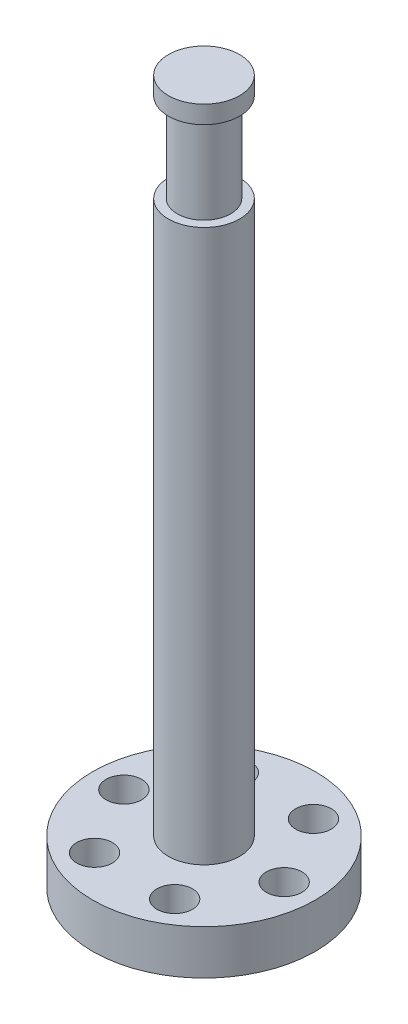
ISO-10303-21;
HEADER;
FILE_DESCRIPTION(('STEP AP214'),'2;1');
FILE_NAME('part.step','',(''),(''),'','','');
FILE_SCHEMA(('AUTOMOTIVE_DESIGN { 1 0 10303 214 1 1 1 1 }'));
ENDSEC;
DATA;
#1=APPLICATION_CONTEXT('core data for automotive mechanical design processes');
#2=APPLICATION_PROTOCOL_DEFINITION('international standard','automotive_design',2000,#1);
#3=PRODUCT_CONTEXT('',#1,'mechanical');
#4=PRODUCT('Part','Part','',(#3));
#5=PRODUCT_RELATED_PRODUCT_CATEGORY('part','',(#4));
#6=PRODUCT_DEFINITION_FORMATION('','',#4);
#7=PRODUCT_DEFINITION_CONTEXT('part definition',#1,'design');
#8=PRODUCT_DEFINITION('design','',#6,#7);
#9=PRODUCT_DEFINITION_SHAPE('','',#8);
#10=(LENGTH_UNIT() NAMED_UNIT(*) SI_UNIT(.MILLI.,.METRE.));
#11=(NAMED_UNIT(*) PLANE_ANGLE_UNIT() SI_UNIT($,.RADIAN.));
#12=(NAMED_UNIT(*) SI_UNIT($,.STERADIAN.) SOLID_ANGLE_UNIT());
#13=UNCERTAINTY_MEASURE_WITH_UNIT(LENGTH_MEASURE(1.E-05),#10,'distance_accuracy_value','');
#14=(GEOMETRIC_REPRESENTATION_CONTEXT(3) GLOBAL_UNCERTAINTY_ASSIGNED_CONTEXT((#13)) GLOBAL_UNIT_ASSIGNED_CONTEXT((#10,
#11,#12)) REPRESENTATION_CONTEXT('',''));
#15=CARTESIAN_POINT('',(0.,0.,0.));
#16=DIRECTION('',(0.,0.,1.));
#17=DIRECTION('',(1.,0.,0.));
#18=AXIS2_PLACEMENT_3D('',#15,#16,#17);
#19=CARTESIAN_POINT('',(0.,5.,0.));
#20=DIRECTION('',(0.,1.,0.));
#21=DIRECTION('',(0.,0.,1.));
#22=AXIS2_PLACEMENT_3D('',#19,#20,#21);
#23=CYLINDRICAL_SURFACE('',#22,4.);
#24=CARTESIAN_POINT('',(0.,5.,0.));
#25=DIRECTION('',(0.,1.,0.));
#26=DIRECTION('',(0.,0.,1.));
#27=AXIS2_PLACEMENT_3D('',#24,#25,#26);
#28=CIRCLE('',#27,4.);
#29=CARTESIAN_POINT('',(0.,5.,4.));
#30=VERTEX_POINT('',#29);
#31=EDGE_CURVE('E139',#30,#30,#28,.T.);
#32=ORIENTED_EDGE('',*,*,#31,.T.);
#33=EDGE_LOOP('',(#32));
#34=FACE_BOUND('',#33,.T.);
#35=CARTESIAN_POINT('',(0.,67.,0.));
#36=DIRECTION('',(0.,1.,0.));
#37=DIRECTION('',(0.,0.,1.));
#38=AXIS2_PLACEMENT_3D('',#35,#36,#37);
#39=CIRCLE('',#38,4.);
#40=CARTESIAN_POINT('',(0.,67.,4.));
#41=VERTEX_POINT('',#40);
#42=EDGE_CURVE('E148',#41,#41,#39,.F.);
#43=ORIENTED_EDGE('',*,*,#42,.T.);
#44=EDGE_LOOP('',(#43));
#45=FACE_BOUND('',#44,.T.);
#46=ADVANCED_FACE('F118',(#34,#45),#23,.T.);
#47=CARTESIAN_POINT('',(0.,79.,0.));
#48=DIRECTION('',(0.,-1.,0.));
#49=DIRECTION('',(0.,0.,-1.));
#50=AXIS2_PLACEMENT_3D('',#47,#48,#49);
#51=CYLINDRICAL_SURFACE('',#50,12.5);
#52=CARTESIAN_POINT('',(0.,0.,0.));
#53=DIRECTION('',(0.,1.,0.));
#54=DIRECTION('',(0.,0.,1.));
#55=AXIS2_PLACEMENT_3D('',#52,#53,#54);
#56=CIRCLE('',#55,12.5);
#57=CARTESIAN_POINT('',(0.,0.,12.5));
#58=VERTEX_POINT('',#57);
#59=EDGE_CURVE('E14',#58,#58,#56,.T.);
#60=ORIENTED_EDGE('',*,*,#59,.T.);
#61=EDGE_LOOP('',(#60));
#62=FACE_BOUND('',#61,.T.);
#63=CARTESIAN_POINT('',(0.,5.,0.));
#64=DIRECTION('',(0.,1.,0.));
#65=DIRECTION('',(0.,0.,1.));
#66=AXIS2_PLACEMENT_3D('',#63,#64,#65);
#67=CIRCLE('',#66,12.5);
#68=CARTESIAN_POINT('',(0.,5.,12.5));
#69=VERTEX_POINT('',#68);
#70=EDGE_CURVE('E126',#69,#69,#67,.T.);
#71=ORIENTED_EDGE('',*,*,#70,.F.);
#72=EDGE_LOOP('',(#71));
#73=FACE_BOUND('',#72,.T.);
#74=ADVANCED_FACE('F122',(#62,#73),#51,.T.);
#75=CARTESIAN_POINT('',(0.,0.,0.));
#76=DIRECTION('',(0.,1.,0.));
#77=DIRECTION('',(0.,0.,1.));
#78=AXIS2_PLACEMENT_3D('',#75,#76,#77);
#79=PLANE('',#78);
#80=CARTESIAN_POINT('',(4.50000000000009,0.,7.79422863405989));
#81=DIRECTION('',(0.,-1.,0.));
#82=DIRECTION('',(0.866025403784433,0.,-0.50000000000001));
#83=AXIS2_PLACEMENT_3D('',#80,#81,#82);
#84=CIRCLE('',#83,2.);
#85=CARTESIAN_POINT('',(6.23205080756896,0.,6.79422863405988));
#86=VERTEX_POINT('',#85);
#87=EDGE_CURVE('E384',#86,#86,#84,.T.);
#88=ORIENTED_EDGE('',*,*,#87,.F.);
#89=EDGE_LOOP('',(#88));
#90=FACE_BOUND('',#89,.T.);
#91=CARTESIAN_POINT('',(-4.49999999999993,0.,7.79422863405999));
#92=DIRECTION('',(0.,-1.,0.));
#93=DIRECTION('',(0.866025403784443,0.,0.499999999999992));
#94=AXIS2_PLACEMENT_3D('',#91,#92,#93);
#95=CIRCLE('',#94,2.);
#96=CARTESIAN_POINT('',(-2.76794919243104,0.,8.79422863405997));
#97=VERTEX_POINT('',#96);
#98=EDGE_CURVE('E381',#97,#97,#95,.T.);
#99=ORIENTED_EDGE('',*,*,#98,.F.);
#100=EDGE_LOOP('',(#99));
#101=FACE_BOUND('',#100,.T.);
#102=CARTESIAN_POINT('',(-9.,0.,0.));
#103=DIRECTION('',(0.,-1.,0.));
#104=DIRECTION('',(0.,0.,1.));
#105=AXIS2_PLACEMENT_3D('',#102,#103,#104);
#106=CIRCLE('',#105,2.);
#107=CARTESIAN_POINT('',(-9.,0.,2.));
#108=VERTEX_POINT('',#107);
#109=EDGE_CURVE('E390',#108,#108,#106,.T.);
#110=ORIENTED_EDGE('',*,*,#109,.F.);
#111=EDGE_LOOP('',(#110));
#112=FACE_BOUND('',#111,.T.);
#113=CARTESIAN_POINT('',(-4.50000000000004,0.,-7.79422863405993));
#114=DIRECTION('',(0.,-1.,0.));
#115=DIRECTION('',(-0.866025403784436,0.,0.500000000000004));
#116=AXIS2_PLACEMENT_3D('',#113,#114,#115);
#117=CIRCLE('',#116,2.);
#118=CARTESIAN_POINT('',(-6.23205080756891,0.,-6.79422863405992));
#119=VERTEX_POINT('',#118);
#120=EDGE_CURVE('E393',#119,#119,#117,.T.);
#121=ORIENTED_EDGE('',*,*,#120,.F.);
#122=EDGE_LOOP('',(#121));
#123=FACE_BOUND('',#122,.T.);
#124=CARTESIAN_POINT('',(4.49999999999998,0.,-7.79422863405996));
#125=DIRECTION('',(0.,-1.,0.));
#126=DIRECTION('',(-0.86602540378444,0.,-0.499999999999998));
#127=AXIS2_PLACEMENT_3D('',#124,#125,#126);
#128=CIRCLE('',#127,2.);
#129=CARTESIAN_POINT('',(2.7679491924311,0.,-8.79422863405995));
#130=VERTEX_POINT('',#129);
#131=EDGE_CURVE('E161',#130,#130,#128,.T.);
#132=ORIENTED_EDGE('',*,*,#131,.F.);
#133=EDGE_LOOP('',(#132));
#134=FACE_BOUND('',#133,.T.);
#135=CARTESIAN_POINT('',(9.,0.,0.));
#136=DIRECTION('',(0.,-1.,0.));
#137=DIRECTION('',(0.,0.,-1.));
#138=AXIS2_PLACEMENT_3D('',#135,#136,#137);
#139=CIRCLE('',#138,2.);
#140=CARTESIAN_POINT('',(9.,0.,-2.));
#141=VERTEX_POINT('',#140);
#142=EDGE_CURVE('E159',#141,#141,#139,.T.);
#143=ORIENTED_EDGE('',*,*,#142,.F.);
#144=EDGE_LOOP('',(#143));
#145=FACE_BOUND('',#144,.T.);
#146=ORIENTED_EDGE('',*,*,#59,.F.);
#147=EDGE_LOOP('',(#146));
#148=FACE_BOUND('',#147,.T.);
#149=ADVANCED_FACE('F215',(#90,#101,#112,#123,#134,#145,#148),#79,.F.);
#150=CARTESIAN_POINT('',(0.,5.,0.));
#151=DIRECTION('',(0.,1.,0.));
#152=DIRECTION('',(0.,0.,1.));
#153=AXIS2_PLACEMENT_3D('',#150,#151,#152);
#154=PLANE('',#153);
#155=CARTESIAN_POINT('',(4.50000000000009,5.,7.79422863405989));
#156=DIRECTION('',(0.,1.,0.));
#157=DIRECTION('',(0.,0.,1.));
#158=AXIS2_PLACEMENT_3D('',#155,#156,#157);
#159=CIRCLE('',#158,2.);
#160=CARTESIAN_POINT('',(4.50000000000009,5.,9.79422863405989));
#161=VERTEX_POINT('',#160);
#162=EDGE_CURVE('E124',#161,#161,#159,.T.);
#163=ORIENTED_EDGE('',*,*,#162,.F.);
#164=EDGE_LOOP('',(#163));
#165=FACE_BOUND('',#164,.T.);
#166=CARTESIAN_POINT('',(-4.49999999999993,5.,7.79422863405999));
#167=DIRECTION('',(0.,1.,0.));
#168=DIRECTION('',(0.,0.,1.));
#169=AXIS2_PLACEMENT_3D('',#166,#167,#168);
#170=CIRCLE('',#169,2.);
#171=CARTESIAN_POINT('',(-4.49999999999993,5.,9.79422863405999));
#172=VERTEX_POINT('',#171);
#173=EDGE_CURVE('E167',#172,#172,#170,.T.);
#174=ORIENTED_EDGE('',*,*,#173,.F.);
#175=EDGE_LOOP('',(#174));
#176=FACE_BOUND('',#175,.T.);
#177=CARTESIAN_POINT('',(-9.,5.,0.));
#178=DIRECTION('',(0.,1.,0.));
#179=DIRECTION('',(0.,0.,1.));
#180=AXIS2_PLACEMENT_3D('',#177,#178,#179);
#181=CIRCLE('',#180,2.);
#182=CARTESIAN_POINT('',(-9.,5.,2.));
#183=VERTEX_POINT('',#182);
#184=EDGE_CURVE('E170',#183,#183,#181,.T.);
#185=ORIENTED_EDGE('',*,*,#184,.F.);
#186=EDGE_LOOP('',(#185));
#187=FACE_BOUND('',#186,.T.);
#188=CARTESIAN_POINT('',(-4.50000000000004,5.,-7.79422863405993));
#189=DIRECTION('',(0.,1.,0.));
#190=DIRECTION('',(0.,0.,1.));
#191=AXIS2_PLACEMENT_3D('',#188,#189,#190);
#192=CIRCLE('',#191,2.);
#193=CARTESIAN_POINT('',(-4.50000000000004,5.,-5.79422863405993));
#194=VERTEX_POINT('',#193);
#195=EDGE_CURVE('E162',#194,#194,#192,.T.);
#196=ORIENTED_EDGE('',*,*,#195,.F.);
#197=EDGE_LOOP('',(#196));
#198=FACE_BOUND('',#197,.T.);
#199=CARTESIAN_POINT('',(4.49999999999998,5.,-7.79422863405996));
#200=DIRECTION('',(0.,1.,0.));
#201=DIRECTION('',(0.,0.,1.));
#202=AXIS2_PLACEMENT_3D('',#199,#200,#201);
#203=CIRCLE('',#202,2.);
#204=CARTESIAN_POINT('',(4.49999999999998,5.,-5.79422863405996));
#205=VERTEX_POINT('',#204);
#206=EDGE_CURVE('E157',#205,#205,#203,.T.);
#207=ORIENTED_EDGE('',*,*,#206,.F.);
#208=EDGE_LOOP('',(#207));
#209=FACE_BOUND('',#208,.T.);
#210=CARTESIAN_POINT('',(9.,5.,0.));
#211=DIRECTION('',(0.,1.,0.));
#212=DIRECTION('',(0.,0.,1.));
#213=AXIS2_PLACEMENT_3D('',#210,#211,#212);
#214=CIRCLE('',#213,2.);
#215=CARTESIAN_POINT('',(9.,5.,2.));
#216=VERTEX_POINT('',#215);
#217=EDGE_CURVE('E155',#216,#216,#214,.T.);
#218=ORIENTED_EDGE('',*,*,#217,.F.);
#219=EDGE_LOOP('',(#218));
#220=FACE_BOUND('',#219,.T.);
#221=ORIENTED_EDGE('',*,*,#31,.F.);
#222=EDGE_LOOP('',(#221));
#223=FACE_BOUND('',#222,.T.);
#224=ORIENTED_EDGE('',*,*,#70,.T.);
#225=EDGE_LOOP('',(#224));
#226=FACE_BOUND('',#225,.T.);
#227=ADVANCED_FACE('F206',(#165,#176,#187,#198,#209,#220,#223,#226),#154,.T.);
#228=CARTESIAN_POINT('',(0.,67.,0.));
#229=DIRECTION('',(0.,1.,0.));
#230=DIRECTION('',(0.,0.,1.));
#231=AXIS2_PLACEMENT_3D('',#228,#229,#230);
#232=PLANE('',#231);
#233=ORIENTED_EDGE('',*,*,#42,.F.);
#234=EDGE_LOOP('',(#233));
#235=FACE_BOUND('',#234,.T.);
#236=CARTESIAN_POINT('',(0.,67.,0.));
#237=DIRECTION('',(0.,1.,0.));
#238=DIRECTION('',(0.,0.,1.));
#239=AXIS2_PLACEMENT_3D('',#236,#237,#238);
#240=CIRCLE('',#239,3.);
#241=CARTESIAN_POINT('',(0.,67.,3.));
#242=VERTEX_POINT('',#241);
#243=EDGE_CURVE('E150',#242,#242,#240,.T.);
#244=ORIENTED_EDGE('',*,*,#243,.F.);
#245=EDGE_LOOP('',(#244));
#246=FACE_BOUND('',#245,.T.);
#247=ADVANCED_FACE('F213',(#235,#246),#232,.T.);
#248=CARTESIAN_POINT('',(0.,77.,0.));
#249=DIRECTION('',(0.,1.,0.));
#250=DIRECTION('',(0.,0.,1.));
#251=AXIS2_PLACEMENT_3D('',#248,#249,#250);
#252=PLANE('',#251);
#253=CARTESIAN_POINT('',(0.,77.,0.));
#254=DIRECTION('',(0.,1.,0.));
#255=DIRECTION('',(0.,0.,1.));
#256=AXIS2_PLACEMENT_3D('',#253,#254,#255);
#257=CIRCLE('',#256,4.);
#258=CARTESIAN_POINT('',(0.,77.,4.));
#259=VERTEX_POINT('',#258);
#260=EDGE_CURVE('E145',#259,#259,#257,.F.);
#261=ORIENTED_EDGE('',*,*,#260,.T.);
#262=EDGE_LOOP('',(#261));
#263=FACE_BOUND('',#262,.T.);
#264=CARTESIAN_POINT('',(0.,77.,0.));
#265=DIRECTION('',(0.,1.,0.));
#266=DIRECTION('',(0.,0.,1.));
#267=AXIS2_PLACEMENT_3D('',#264,#265,#266);
#268=CIRCLE('',#267,3.);
#269=CARTESIAN_POINT('',(0.,77.,3.));
#270=VERTEX_POINT('',#269);
#271=EDGE_CURVE('E158',#270,#270,#268,.T.);
#272=ORIENTED_EDGE('',*,*,#271,.T.);
#273=EDGE_LOOP('',(#272));
#274=FACE_BOUND('',#273,.T.);
#275=ADVANCED_FACE('F241',(#263,#274),#252,.F.);
#276=CARTESIAN_POINT('',(0.,67.,0.));
#277=DIRECTION('',(0.,1.,0.));
#278=DIRECTION('',(0.,0.,1.));
#279=AXIS2_PLACEMENT_3D('',#276,#277,#278);
#280=CYLINDRICAL_SURFACE('',#279,3.);
#281=ORIENTED_EDGE('',*,*,#243,.T.);
#282=EDGE_LOOP('',(#281));
#283=FACE_BOUND('',#282,.T.);
#284=ORIENTED_EDGE('',*,*,#271,.F.);
#285=EDGE_LOOP('',(#284));
#286=FACE_BOUND('',#285,.T.);
#287=ADVANCED_FACE('F236',(#283,#286),#280,.T.);
#288=CARTESIAN_POINT('',(0.,79.,0.));
#289=DIRECTION('',(0.,1.,0.));
#290=DIRECTION('',(0.,0.,1.));
#291=AXIS2_PLACEMENT_3D('',#288,#289,#290);
#292=PLANE('',#291);
#293=CARTESIAN_POINT('',(0.,79.,0.));
#294=DIRECTION('',(0.,1.,0.));
#295=DIRECTION('',(0.,0.,1.));
#296=AXIS2_PLACEMENT_3D('',#293,#294,#295);
#297=CIRCLE('',#296,4.);
#298=CARTESIAN_POINT('',(0.,79.,4.));
#299=VERTEX_POINT('',#298);
#300=EDGE_CURVE('E152',#299,#299,#297,.T.);
#301=ORIENTED_EDGE('',*,*,#300,.T.);
#302=EDGE_LOOP('',(#301));
#303=FACE_BOUND('',#302,.T.);
#304=ADVANCED_FACE('F226',(#303),#292,.T.);
#305=ORIENTED_EDGE('',*,*,#260,.F.);
#306=EDGE_LOOP('',(#305));
#307=FACE_BOUND('',#306,.T.);
#308=ORIENTED_EDGE('',*,*,#300,.F.);
#309=EDGE_LOOP('',(#308));
#310=FACE_BOUND('',#309,.T.);
#311=ADVANCED_FACE('F222',(#307,#310),#23,.T.);
#312=CARTESIAN_POINT('',(9.,79.,0.));
#313=DIRECTION('',(0.,-1.,0.));
#314=DIRECTION('',(0.,0.,-1.));
#315=AXIS2_PLACEMENT_3D('',#312,#313,#314);
#316=CYLINDRICAL_SURFACE('',#315,2.);
#317=ORIENTED_EDGE('',*,*,#217,.T.);
#318=EDGE_LOOP('',(#317));
#319=FACE_BOUND('',#318,.T.);
#320=ORIENTED_EDGE('',*,*,#142,.T.);
#321=EDGE_LOOP('',(#320));
#322=FACE_BOUND('',#321,.T.);
#323=ADVANCED_FACE('F227',(#319,#322),#316,.F.);
#324=CARTESIAN_POINT('',(4.49999999999998,79.,-7.79422863405996));
#325=DIRECTION('',(0.,-1.,0.));
#326=DIRECTION('',(0.,0.,-1.));
#327=AXIS2_PLACEMENT_3D('',#324,#325,#326);
#328=CYLINDRICAL_SURFACE('',#327,2.);
#329=ORIENTED_EDGE('',*,*,#206,.T.);
#330=EDGE_LOOP('',(#329));
#331=FACE_BOUND('',#330,.T.);
#332=ORIENTED_EDGE('',*,*,#131,.T.);
#333=EDGE_LOOP('',(#332));
#334=FACE_BOUND('',#333,.T.);
#335=ADVANCED_FACE('F231',(#331,#334),#328,.F.);
#336=CARTESIAN_POINT('',(-4.50000000000004,79.,-7.79422863405993));
#337=DIRECTION('',(0.,-1.,0.));
#338=DIRECTION('',(0.,0.,-1.));
#339=AXIS2_PLACEMENT_3D('',#336,#337,#338);
#340=CYLINDRICAL_SURFACE('',#339,2.);
#341=ORIENTED_EDGE('',*,*,#195,.T.);
#342=EDGE_LOOP('',(#341));
#343=FACE_BOUND('',#342,.T.);
#344=ORIENTED_EDGE('',*,*,#120,.T.);
#345=EDGE_LOOP('',(#344));
#346=FACE_BOUND('',#345,.T.);
#347=ADVANCED_FACE('F305',(#343,#346),#340,.F.);
#348=CARTESIAN_POINT('',(-9.,79.,0.));
#349=DIRECTION('',(0.,-1.,0.));
#350=DIRECTION('',(0.,0.,-1.));
#351=AXIS2_PLACEMENT_3D('',#348,#349,#350);
#352=CYLINDRICAL_SURFACE('',#351,2.);
#353=ORIENTED_EDGE('',*,*,#184,.T.);
#354=EDGE_LOOP('',(#353));
#355=FACE_BOUND('',#354,.T.);
#356=ORIENTED_EDGE('',*,*,#109,.T.);
#357=EDGE_LOOP('',(#356));
#358=FACE_BOUND('',#357,.T.);
#359=ADVANCED_FACE('F311',(#355,#358),#352,.F.);
#360=CARTESIAN_POINT('',(-4.49999999999993,79.,7.79422863405999));
#361=DIRECTION('',(0.,-1.,0.));
#362=DIRECTION('',(0.,0.,-1.));
#363=AXIS2_PLACEMENT_3D('',#360,#361,#362);
#364=CYLINDRICAL_SURFACE('',#363,2.);
#365=ORIENTED_EDGE('',*,*,#173,.T.);
#366=EDGE_LOOP('',(#365));
#367=FACE_BOUND('',#366,.T.);
#368=ORIENTED_EDGE('',*,*,#98,.T.);
#369=EDGE_LOOP('',(#368));
#370=FACE_BOUND('',#369,.T.);
#371=ADVANCED_FACE('F323',(#367,#370),#364,.F.);
#372=CARTESIAN_POINT('',(4.50000000000009,79.,7.79422863405989));
#373=DIRECTION('',(0.,-1.,0.));
#374=DIRECTION('',(0.,0.,-1.));
#375=AXIS2_PLACEMENT_3D('',#372,#373,#374);
#376=CYLINDRICAL_SURFACE('',#375,2.);
#377=ORIENTED_EDGE('',*,*,#162,.T.);
#378=EDGE_LOOP('',(#377));
#379=FACE_BOUND('',#378,.T.);
#380=ORIENTED_EDGE('',*,*,#87,.T.);
#381=EDGE_LOOP('',(#380));
#382=FACE_BOUND('',#381,.T.);
#383=ADVANCED_FACE('F333',(#379,#382),#376,.F.);
#384=CLOSED_SHELL('',(#46,#74,#149,#227,#247,#275,#287,#304,#311,#323,#335,#347,#359,#371,#383));
#385=MANIFOLD_SOLID_BREP('B2',#384);
#386=ADVANCED_BREP_SHAPE_REPRESENTATION('',(#18,#385),#14);
#387=SHAPE_DEFINITION_REPRESENTATION(#9,#386);
ENDSEC;
END-ISO-10303-21;
